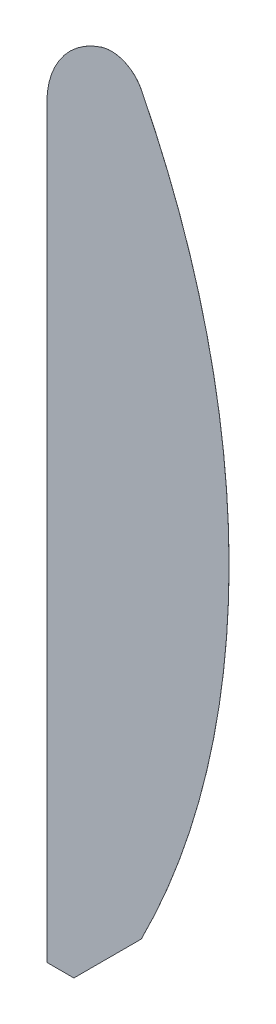
ISO-10303-21;
HEADER;
FILE_DESCRIPTION(('STEP AP214'),'2;1');
FILE_NAME('part.step','',(''),(''),'','','');
FILE_SCHEMA(('AUTOMOTIVE_DESIGN { 1 0 10303 214 1 1 1 1 }'));
ENDSEC;
DATA;
#1=APPLICATION_CONTEXT('core data for automotive mechanical design processes');
#2=APPLICATION_PROTOCOL_DEFINITION('international standard','automotive_design',2000,#1);
#3=PRODUCT_CONTEXT('',#1,'mechanical');
#4=PRODUCT('Part','Part','',(#3));
#5=PRODUCT_RELATED_PRODUCT_CATEGORY('part','',(#4));
#6=PRODUCT_DEFINITION_FORMATION('','',#4);
#7=PRODUCT_DEFINITION_CONTEXT('part definition',#1,'design');
#8=PRODUCT_DEFINITION('design','',#6,#7);
#9=PRODUCT_DEFINITION_SHAPE('','',#8);
#10=(LENGTH_UNIT() NAMED_UNIT(*) SI_UNIT(.MILLI.,.METRE.));
#11=(NAMED_UNIT(*) PLANE_ANGLE_UNIT() SI_UNIT($,.RADIAN.));
#12=(NAMED_UNIT(*) SI_UNIT($,.STERADIAN.) SOLID_ANGLE_UNIT());
#13=UNCERTAINTY_MEASURE_WITH_UNIT(LENGTH_MEASURE(1.E-05),#10,'distance_accuracy_value','');
#14=(GEOMETRIC_REPRESENTATION_CONTEXT(3) GLOBAL_UNCERTAINTY_ASSIGNED_CONTEXT((#13)) GLOBAL_UNIT_ASSIGNED_CONTEXT((#10,
#11,#12)) REPRESENTATION_CONTEXT('',''));
#15=CARTESIAN_POINT('',(0.,0.,0.));
#16=DIRECTION('',(0.,0.,1.));
#17=DIRECTION('',(1.,0.,0.));
#18=AXIS2_PLACEMENT_3D('',#15,#16,#17);
#19=CARTESIAN_POINT('',(0.,0.,0.01));
#20=DIRECTION('',(0.,1.,0.));
#21=DIRECTION('',(-1.,0.,0.));
#22=AXIS2_PLACEMENT_3D('',#19,#20,#21);
#23=PLANE('',#22);
#24=DIRECTION('',(1.,0.,0.));
#25=VECTOR('',#24,1.);
#26=CARTESIAN_POINT('',(0.,0.,0.));
#27=LINE('',#26,#25);
#28=CARTESIAN_POINT('',(0.,0.,0.));
#29=VERTEX_POINT('',#28);
#30=CARTESIAN_POINT('',(5.,0.,0.));
#31=VERTEX_POINT('',#30);
#32=EDGE_CURVE('E125',#29,#31,#27,.T.);
#33=ORIENTED_EDGE('',*,*,#32,.T.);
#34=DIRECTION('',(0.,0.,-1.));
#35=VECTOR('',#34,1.);
#36=CARTESIAN_POINT('',(5.,0.,0.01));
#37=LINE('',#36,#35);
#38=CARTESIAN_POINT('',(5.,0.,0.01));
#39=VERTEX_POINT('',#38);
#40=EDGE_CURVE('E11',#39,#31,#37,.T.);
#41=ORIENTED_EDGE('',*,*,#40,.F.);
#42=DIRECTION('',(1.,0.,0.));
#43=VECTOR('',#42,1.);
#44=CARTESIAN_POINT('',(0.,0.,0.01));
#45=LINE('',#44,#43);
#46=CARTESIAN_POINT('',(0.,0.,0.01));
#47=VERTEX_POINT('',#46);
#48=EDGE_CURVE('E137',#47,#39,#45,.T.);
#49=ORIENTED_EDGE('',*,*,#48,.F.);
#50=DIRECTION('',(0.,0.,-1.));
#51=VECTOR('',#50,1.);
#52=CARTESIAN_POINT('',(0.,0.,0.01));
#53=LINE('',#52,#51);
#54=EDGE_CURVE('E54',#47,#29,#53,.T.);
#55=ORIENTED_EDGE('',*,*,#54,.T.);
#56=EDGE_LOOP('',(#33,#41,#49,#55));
#57=FACE_BOUND('',#56,.T.);
#58=ADVANCED_FACE('F39',(#57),#23,.F.);
#59=CARTESIAN_POINT('',(5.,0.,0.01));
#60=DIRECTION('',(-0.707106781186547,0.707106781186547,0.));
#61=DIRECTION('',(-0.707106781186548,-0.707106781186548,0.));
#62=AXIS2_PLACEMENT_3D('',#59,#60,#61);
#63=PLANE('',#62);
#64=DIRECTION('',(0.707106781186547,0.707106781186547,0.));
#65=VECTOR('',#64,1.);
#66=CARTESIAN_POINT('',(5.,0.,0.));
#67=LINE('',#66,#65);
#68=CARTESIAN_POINT('',(17.5,12.4999999999999,0.));
#69=VERTEX_POINT('',#68);
#70=EDGE_CURVE('E123',#31,#69,#67,.T.);
#71=ORIENTED_EDGE('',*,*,#70,.T.);
#72=DIRECTION('',(0.,0.,-1.));
#73=VECTOR('',#72,1.);
#74=CARTESIAN_POINT('',(17.5,12.4999999999999,0.01));
#75=LINE('',#74,#73);
#76=CARTESIAN_POINT('',(17.5,12.4999999999999,0.01));
#77=VERTEX_POINT('',#76);
#78=EDGE_CURVE('E50',#77,#69,#75,.T.);
#79=ORIENTED_EDGE('',*,*,#78,.F.);
#80=DIRECTION('',(0.707106781186547,0.707106781186547,0.));
#81=VECTOR('',#80,1.);
#82=CARTESIAN_POINT('',(5.,0.,0.01));
#83=LINE('',#82,#81);
#84=EDGE_CURVE('E87',#39,#77,#83,.T.);
#85=ORIENTED_EDGE('',*,*,#84,.F.);
#86=ORIENTED_EDGE('',*,*,#40,.T.);
#87=EDGE_LOOP('',(#71,#79,#85,#86));
#88=FACE_BOUND('',#87,.T.);
#89=ADVANCED_FACE('F156',(#88),#63,.F.);
#90=CARTESIAN_POINT('',(-117.236872534037,80.7011714602204,0.01));
#91=DIRECTION('',(0.,0.,-1.));
#92=DIRECTION('',(-1.,0.,0.));
#93=AXIS2_PLACEMENT_3D('',#90,#91,#92);
#94=CYLINDRICAL_SURFACE('',#93,151.014650311815);
#95=CARTESIAN_POINT('',(-117.236872534037,80.7011714602204,0.));
#96=DIRECTION('',(0.,0.,1.));
#97=DIRECTION('',(1.,0.,0.));
#98=AXIS2_PLACEMENT_3D('',#95,#96,#97);
#99=CIRCLE('',#98,151.014650311815);
#100=CARTESIAN_POINT('',(17.5,148.902342920441,0.));
#101=VERTEX_POINT('',#100);
#102=EDGE_CURVE('E130',#69,#101,#99,.T.);
#103=ORIENTED_EDGE('',*,*,#102,.T.);
#104=DIRECTION('',(0.,0.,-1.));
#105=VECTOR('',#104,1.);
#106=CARTESIAN_POINT('',(17.5,148.902342920441,0.01));
#107=LINE('',#106,#105);
#108=CARTESIAN_POINT('',(17.5,148.902342920441,0.01));
#109=VERTEX_POINT('',#108);
#110=EDGE_CURVE('E106',#109,#101,#107,.T.);
#111=ORIENTED_EDGE('',*,*,#110,.F.);
#112=CARTESIAN_POINT('',(-117.236872534037,80.7011714602204,0.01));
#113=DIRECTION('',(0.,0.,1.));
#114=DIRECTION('',(1.,0.,0.));
#115=AXIS2_PLACEMENT_3D('',#112,#113,#114);
#116=CIRCLE('',#115,151.014650311815);
#117=EDGE_CURVE('E111',#77,#109,#116,.T.);
#118=ORIENTED_EDGE('',*,*,#117,.F.);
#119=ORIENTED_EDGE('',*,*,#78,.T.);
#120=EDGE_LOOP('',(#103,#111,#118,#119));
#121=FACE_BOUND('',#120,.T.);
#122=ADVANCED_FACE('F142',(#121),#94,.T.);
#123=CARTESIAN_POINT('',(11.9500012724863,146.093042038653,0.01));
#124=DIRECTION('',(0.,0.,-1.));
#125=DIRECTION('',(-1.,0.,0.));
#126=AXIS2_PLACEMENT_3D('',#123,#124,#125);
#127=CYLINDRICAL_SURFACE('',#126,6.2205029796485);
#128=CARTESIAN_POINT('',(11.9500012724863,146.093042038653,0.));
#129=DIRECTION('',(0.,0.,-1.));
#130=DIRECTION('',(-1.,0.,0.));
#131=AXIS2_PLACEMENT_3D('',#128,#129,#130);
#132=CIRCLE('',#131,6.2205029796485);
#133=CARTESIAN_POINT('',(10.,152.,0.));
#134=VERTEX_POINT('',#133);
#135=EDGE_CURVE('E105',#134,#101,#132,.T.);
#136=ORIENTED_EDGE('',*,*,#135,.F.);
#137=DIRECTION('',(0.,0.,-1.));
#138=VECTOR('',#137,1.);
#139=CARTESIAN_POINT('',(10.,152.,0.01));
#140=LINE('',#139,#138);
#141=CARTESIAN_POINT('',(10.,152.,0.01));
#142=VERTEX_POINT('',#141);
#143=EDGE_CURVE('E100',#142,#134,#140,.T.);
#144=ORIENTED_EDGE('',*,*,#143,.F.);
#145=CARTESIAN_POINT('',(11.9500012724863,146.093042038653,0.01));
#146=DIRECTION('',(0.,0.,-1.));
#147=DIRECTION('',(-1.,0.,0.));
#148=AXIS2_PLACEMENT_3D('',#145,#146,#147);
#149=CIRCLE('',#148,6.2205029796485);
#150=EDGE_CURVE('E99',#142,#109,#149,.T.);
#151=ORIENTED_EDGE('',*,*,#150,.T.);
#152=ORIENTED_EDGE('',*,*,#110,.T.);
#153=EDGE_LOOP('',(#136,#144,#151,#152));
#154=FACE_BOUND('',#153,.T.);
#155=ADVANCED_FACE('F97',(#154),#127,.T.);
#156=CARTESIAN_POINT('',(14.5662111999999,138.168,0.01));
#157=DIRECTION('',(0.,0.,-1.));
#158=DIRECTION('',(-1.,0.,0.));
#159=AXIS2_PLACEMENT_3D('',#156,#157,#158);
#160=CYLINDRICAL_SURFACE('',#159,14.5662111999999);
#161=CARTESIAN_POINT('',(14.5662111999999,138.168,0.));
#162=DIRECTION('',(0.,0.,-1.));
#163=DIRECTION('',(-1.,0.,0.));
#164=AXIS2_PLACEMENT_3D('',#161,#162,#163);
#165=CIRCLE('',#164,14.5662111999999);
#166=CARTESIAN_POINT('',(0.,138.168,0.));
#167=VERTEX_POINT('',#166);
#168=EDGE_CURVE('E132',#167,#134,#165,.T.);
#169=ORIENTED_EDGE('',*,*,#168,.F.);
#170=DIRECTION('',(0.,0.,-1.));
#171=VECTOR('',#170,1.);
#172=CARTESIAN_POINT('',(0.,138.168,0.01));
#173=LINE('',#172,#171);
#174=CARTESIAN_POINT('',(0.,138.168,0.01));
#175=VERTEX_POINT('',#174);
#176=EDGE_CURVE('E73',#175,#167,#173,.T.);
#177=ORIENTED_EDGE('',*,*,#176,.F.);
#178=CARTESIAN_POINT('',(14.5662111999999,138.168,0.01));
#179=DIRECTION('',(0.,0.,-1.));
#180=DIRECTION('',(-1.,0.,0.));
#181=AXIS2_PLACEMENT_3D('',#178,#179,#180);
#182=CIRCLE('',#181,14.5662111999999);
#183=EDGE_CURVE('E115',#175,#142,#182,.T.);
#184=ORIENTED_EDGE('',*,*,#183,.T.);
#185=ORIENTED_EDGE('',*,*,#143,.T.);
#186=EDGE_LOOP('',(#169,#177,#184,#185));
#187=FACE_BOUND('',#186,.T.);
#188=ADVANCED_FACE('F120',(#187),#160,.T.);
#189=CARTESIAN_POINT('',(0.,0.,0.01));
#190=DIRECTION('',(-1.,0.,0.));
#191=DIRECTION('',(0.,-1.,0.));
#192=AXIS2_PLACEMENT_3D('',#189,#190,#191);
#193=PLANE('',#192);
#194=DIRECTION('',(0.,1.,0.));
#195=VECTOR('',#194,1.);
#196=CARTESIAN_POINT('',(0.,0.,0.));
#197=LINE('',#196,#195);
#198=EDGE_CURVE('E134',#29,#167,#197,.T.);
#199=ORIENTED_EDGE('',*,*,#198,.F.);
#200=ORIENTED_EDGE('',*,*,#54,.F.);
#201=DIRECTION('',(0.,1.,0.));
#202=VECTOR('',#201,1.);
#203=CARTESIAN_POINT('',(0.,0.,0.01));
#204=LINE('',#203,#202);
#205=EDGE_CURVE('E119',#47,#175,#204,.T.);
#206=ORIENTED_EDGE('',*,*,#205,.T.);
#207=ORIENTED_EDGE('',*,*,#176,.T.);
#208=EDGE_LOOP('',(#199,#200,#206,#207));
#209=FACE_BOUND('',#208,.T.);
#210=ADVANCED_FACE('F144',(#209),#193,.T.);
#211=CARTESIAN_POINT('',(-117.236872534037,80.7011714602204,0.01));
#212=DIRECTION('',(0.,0.,1.));
#213=DIRECTION('',(1.,0.,0.));
#214=AXIS2_PLACEMENT_3D('',#211,#212,#213);
#215=PLANE('',#214);
#216=ORIENTED_EDGE('',*,*,#48,.T.);
#217=ORIENTED_EDGE('',*,*,#84,.T.);
#218=ORIENTED_EDGE('',*,*,#117,.T.);
#219=ORIENTED_EDGE('',*,*,#150,.F.);
#220=ORIENTED_EDGE('',*,*,#183,.F.);
#221=ORIENTED_EDGE('',*,*,#205,.F.);
#222=EDGE_LOOP('',(#216,#217,#218,#219,#220,#221));
#223=FACE_BOUND('',#222,.T.);
#224=ADVANCED_FACE('F109',(#223),#215,.T.);
#225=CARTESIAN_POINT('',(-117.236872534037,80.7011714602204,0.));
#226=DIRECTION('',(0.,0.,1.));
#227=DIRECTION('',(1.,0.,0.));
#228=AXIS2_PLACEMENT_3D('',#225,#226,#227);
#229=PLANE('',#228);
#230=ORIENTED_EDGE('',*,*,#32,.F.);
#231=ORIENTED_EDGE('',*,*,#198,.T.);
#232=ORIENTED_EDGE('',*,*,#168,.T.);
#233=ORIENTED_EDGE('',*,*,#135,.T.);
#234=ORIENTED_EDGE('',*,*,#102,.F.);
#235=ORIENTED_EDGE('',*,*,#70,.F.);
#236=EDGE_LOOP('',(#230,#231,#232,#233,#234,#235));
#237=FACE_BOUND('',#236,.T.);
#238=ADVANCED_FACE('F145',(#237),#229,.F.);
#239=CLOSED_SHELL('',(#58,#89,#122,#155,#188,#210,#224,#238));
#240=MANIFOLD_SOLID_BREP('B2',#239);
#241=ADVANCED_BREP_SHAPE_REPRESENTATION('',(#18,#240),#14);
#242=SHAPE_DEFINITION_REPRESENTATION(#9,#241);
ENDSEC;
END-ISO-10303-21;
